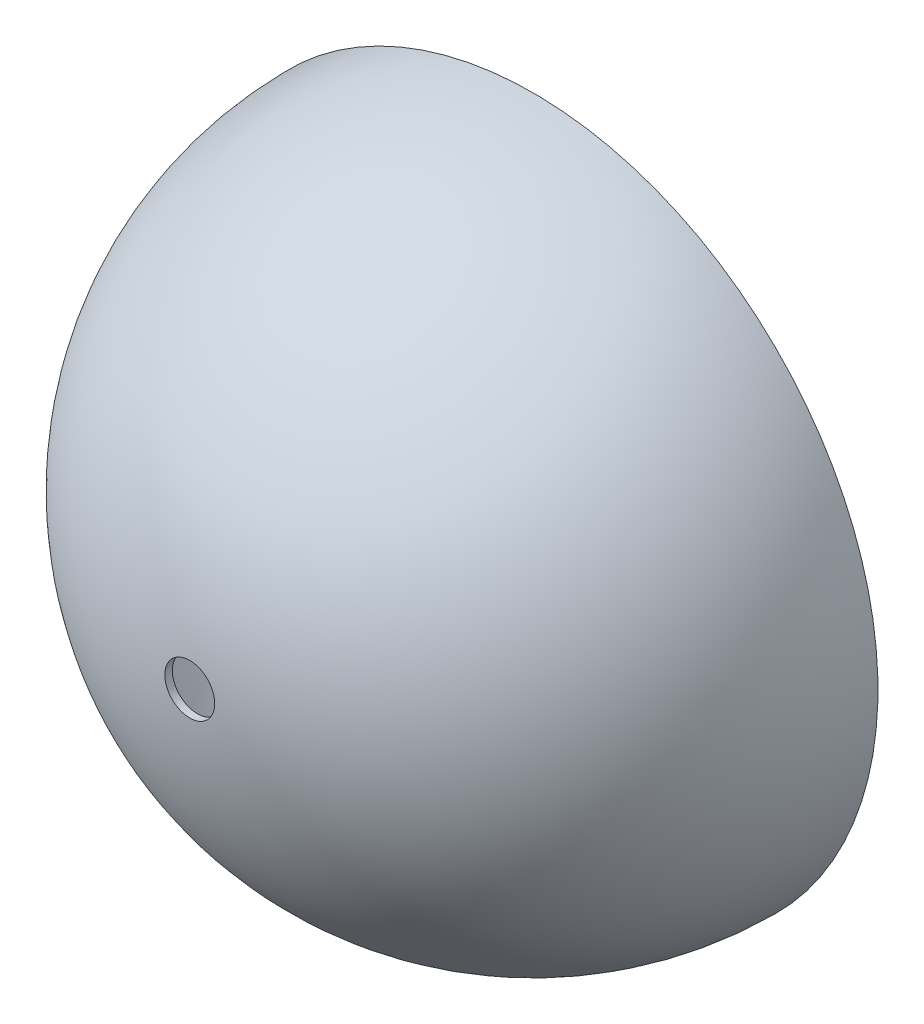
ISO-10303-21;
HEADER;
FILE_DESCRIPTION(('STEP AP214'),'2;1');
FILE_NAME('part.step','',(''),(''),'','','');
FILE_SCHEMA(('AUTOMOTIVE_DESIGN { 1 0 10303 214 1 1 1 1 }'));
ENDSEC;
DATA;
#1=APPLICATION_CONTEXT('core data for automotive mechanical design processes');
#2=APPLICATION_PROTOCOL_DEFINITION('international standard','automotive_design',2000,#1);
#3=PRODUCT_CONTEXT('',#1,'mechanical');
#4=PRODUCT('Part','Part','',(#3));
#5=PRODUCT_RELATED_PRODUCT_CATEGORY('part','',(#4));
#6=PRODUCT_DEFINITION_FORMATION('','',#4);
#7=PRODUCT_DEFINITION_CONTEXT('part definition',#1,'design');
#8=PRODUCT_DEFINITION('design','',#6,#7);
#9=PRODUCT_DEFINITION_SHAPE('','',#8);
#10=(LENGTH_UNIT() NAMED_UNIT(*) SI_UNIT(.MILLI.,.METRE.));
#11=(NAMED_UNIT(*) PLANE_ANGLE_UNIT() SI_UNIT($,.RADIAN.));
#12=(NAMED_UNIT(*) SI_UNIT($,.STERADIAN.) SOLID_ANGLE_UNIT());
#13=UNCERTAINTY_MEASURE_WITH_UNIT(LENGTH_MEASURE(1.E-05),#10,'distance_accuracy_value','');
#14=(GEOMETRIC_REPRESENTATION_CONTEXT(3) GLOBAL_UNCERTAINTY_ASSIGNED_CONTEXT((#13)) GLOBAL_UNIT_ASSIGNED_CONTEXT((#10,
#11,#12)) REPRESENTATION_CONTEXT('',''));
#15=CARTESIAN_POINT('',(0.,0.,0.));
#16=DIRECTION('',(0.,0.,1.));
#17=DIRECTION('',(1.,0.,0.));
#18=AXIS2_PLACEMENT_3D('',#15,#16,#17);
#19=CARTESIAN_POINT('',(-2.81668763803894E-13,0.,0.));
#20=DIRECTION('',(0.,1.,0.));
#21=DIRECTION('',(1.,0.,0.));
#22=AXIS2_PLACEMENT_3D('',#19,#20,#21);
#23=SPHERICAL_SURFACE('',#22,690.);
#24=CARTESIAN_POINT('',(-2.81668763803894E-13,0.,0.));
#25=DIRECTION('',(0.,0.,-1.));
#26=DIRECTION('',(-1.,0.,0.));
#27=AXIS2_PLACEMENT_3D('',#24,#25,#26);
#28=SPHERICAL_SURFACE('',#27,690.);
#29=CARTESIAN_POINT('',(0.,0.,688.18602136341));
#30=DIRECTION('',(0.,0.,-1.));
#31=DIRECTION('',(-1.,0.,0.));
#32=AXIS2_PLACEMENT_3D('',#29,#30,#31);
#33=CIRCLE('',#32,50.);
#34=CARTESIAN_POINT('',(50.,0.,688.18602136341));
#35=VERTEX_POINT('',#34);
#36=EDGE_CURVE('E47',#35,#35,#33,.T.);
#37=ORIENTED_EDGE('',*,*,#36,.T.);
#38=EDGE_LOOP('',(#37));
#39=FACE_BOUND('',#38,.T.);
#40=CARTESIAN_POINT('',(-2.81668763803894E-13,0.,0.));
#41=DIRECTION('',(0.,0.,-1.));
#42=DIRECTION('',(-1.,0.,0.));
#43=AXIS2_PLACEMENT_3D('',#40,#41,#42);
#44=CIRCLE('',#43,690.);
#45=CARTESIAN_POINT('',(-690.,-2.88607657707801E-13,-4.81824424760352E-12));
#46=VERTEX_POINT('',#45);
#47=EDGE_CURVE('E43',#46,#46,#44,.T.);
#48=ORIENTED_EDGE('',*,*,#47,.F.);
#49=EDGE_LOOP('',(#48));
#50=FACE_BOUND('',#49,.T.);
#51=ADVANCED_FACE('F35',(#39,#50),#28,.T.);
#52=CARTESIAN_POINT('',(-2.81668763803894E-13,0.,0.));
#53=DIRECTION('',(0.,1.,0.));
#54=DIRECTION('',(1.,0.,0.));
#55=AXIS2_PLACEMENT_3D('',#52,#53,#54);
#56=SPHERICAL_SURFACE('',#55,675.);
#57=CARTESIAN_POINT('',(-2.81668763803894E-13,0.,0.));
#58=DIRECTION('',(0.,0.,-1.));
#59=DIRECTION('',(-1.,0.,0.));
#60=AXIS2_PLACEMENT_3D('',#57,#58,#59);
#61=SPHERICAL_SURFACE('',#60,675.);
#62=CARTESIAN_POINT('',(0.,0.,673.145600891813));
#63=DIRECTION('',(0.,0.,-1.));
#64=DIRECTION('',(-1.,0.,0.));
#65=AXIS2_PLACEMENT_3D('',#62,#63,#64);
#66=CIRCLE('',#65,50.);
#67=CARTESIAN_POINT('',(50.,0.,673.145600891813));
#68=VERTEX_POINT('',#67);
#69=EDGE_CURVE('E39',#68,#68,#66,.F.);
#70=ORIENTED_EDGE('',*,*,#69,.T.);
#71=EDGE_LOOP('',(#70));
#72=FACE_BOUND('',#71,.T.);
#73=CARTESIAN_POINT('',(-2.81668763803894E-13,0.,0.));
#74=DIRECTION('',(0.,0.,1.));
#75=DIRECTION('',(-1.,0.,0.));
#76=AXIS2_PLACEMENT_3D('',#73,#74,#75);
#77=CIRCLE('',#76,675.);
#78=CARTESIAN_POINT('',(-675.,-2.82484423712064E-13,-4.71349980743823E-12));
#79=VERTEX_POINT('',#78);
#80=EDGE_CURVE('E10',#79,#79,#77,.T.);
#81=ORIENTED_EDGE('',*,*,#80,.F.);
#82=EDGE_LOOP('',(#81));
#83=FACE_BOUND('',#82,.T.);
#84=ADVANCED_FACE('F37',(#72,#83),#61,.F.);
#85=CARTESIAN_POINT('',(-2.81668763803894E-13,0.,0.));
#86=DIRECTION('',(0.,0.,-1.));
#87=DIRECTION('',(-1.,0.,0.));
#88=AXIS2_PLACEMENT_3D('',#85,#86,#87);
#89=PLANE('',#88);
#90=ORIENTED_EDGE('',*,*,#80,.T.);
#91=EDGE_LOOP('',(#90));
#92=FACE_BOUND('',#91,.T.);
#93=ORIENTED_EDGE('',*,*,#47,.T.);
#94=EDGE_LOOP('',(#93));
#95=FACE_BOUND('',#94,.T.);
#96=ADVANCED_FACE('F61',(#92,#95),#89,.T.);
#97=CARTESIAN_POINT('',(0.,0.,-1.2E-05));
#98=DIRECTION('',(0.,0.,1.));
#99=DIRECTION('',(1.,0.,0.));
#100=AXIS2_PLACEMENT_3D('',#97,#98,#99);
#101=CYLINDRICAL_SURFACE('',#100,50.);
#102=CARTESIAN_POINT('',(50.,0.,673.145600891813));
#103=CARTESIAN_POINT('',(50.,0.,673.302271938392));
#104=CARTESIAN_POINT('',(50.,0.,673.458942984971));
#105=CARTESIAN_POINT('',(50.,0.,673.77228507813));
#106=CARTESIAN_POINT('',(50.,0.,673.928956124709));
#107=CARTESIAN_POINT('',(50.,0.,674.242298217867));
#108=CARTESIAN_POINT('',(50.,0.,674.398969264446));
#109=CARTESIAN_POINT('',(50.,0.,674.712311357604));
#110=CARTESIAN_POINT('',(50.,0.,674.868982404184));
#111=CARTESIAN_POINT('',(50.,0.,675.182324497342));
#112=CARTESIAN_POINT('',(50.,0.,675.338995543921));
#113=CARTESIAN_POINT('',(50.,0.,675.652337637079));
#114=CARTESIAN_POINT('',(50.,0.,675.809008683658));
#115=CARTESIAN_POINT('',(50.,0.,676.122350776817));
#116=CARTESIAN_POINT('',(50.,0.,676.279021823396));
#117=CARTESIAN_POINT('',(50.,0.,676.592363916554));
#118=CARTESIAN_POINT('',(50.,0.,676.749034963133));
#119=CARTESIAN_POINT('',(50.,0.,677.062377056291));
#120=CARTESIAN_POINT('',(50.,0.,677.219048102871));
#121=CARTESIAN_POINT('',(50.,0.,677.532390196029));
#122=CARTESIAN_POINT('',(50.,0.,677.689061242608));
#123=CARTESIAN_POINT('',(50.,0.,678.002403335766));
#124=CARTESIAN_POINT('',(50.,0.,678.159074382345));
#125=CARTESIAN_POINT('',(50.,0.,678.472416475504));
#126=CARTESIAN_POINT('',(50.,0.,678.629087522083));
#127=CARTESIAN_POINT('',(50.,0.,678.942429615241));
#128=CARTESIAN_POINT('',(50.,0.,679.09910066182));
#129=CARTESIAN_POINT('',(50.,0.,679.412442754978));
#130=CARTESIAN_POINT('',(50.,0.,679.569113801558));
#131=CARTESIAN_POINT('',(50.,0.,679.882455894716));
#132=CARTESIAN_POINT('',(50.,0.,680.039126941295));
#133=CARTESIAN_POINT('',(50.,0.,680.352469034453));
#134=CARTESIAN_POINT('',(50.,0.,680.509140081032));
#135=CARTESIAN_POINT('',(50.,0.,680.822482174191));
#136=CARTESIAN_POINT('',(50.,0.,680.97915322077));
#137=CARTESIAN_POINT('',(50.,0.,681.292495313928));
#138=CARTESIAN_POINT('',(50.,0.,681.449166360507));
#139=CARTESIAN_POINT('',(50.,0.,681.762508453666));
#140=CARTESIAN_POINT('',(50.,0.,681.919179500245));
#141=CARTESIAN_POINT('',(50.,0.,682.232521593403));
#142=CARTESIAN_POINT('',(50.,0.,682.389192639982));
#143=CARTESIAN_POINT('',(50.,0.,682.70253473314));
#144=CARTESIAN_POINT('',(50.,0.,682.859205779719));
#145=CARTESIAN_POINT('',(50.,0.,683.172547872878));
#146=CARTESIAN_POINT('',(50.,0.,683.329218919457));
#147=CARTESIAN_POINT('',(50.,0.,683.642561012615));
#148=CARTESIAN_POINT('',(50.,0.,683.799232059194));
#149=CARTESIAN_POINT('',(50.,0.,684.112574152353));
#150=CARTESIAN_POINT('',(50.,0.,684.269245198932));
#151=CARTESIAN_POINT('',(50.,0.,684.58258729209));
#152=CARTESIAN_POINT('',(50.,0.,684.739258338669));
#153=CARTESIAN_POINT('',(50.,0.,685.052600431827));
#154=CARTESIAN_POINT('',(50.,0.,685.209271478406));
#155=CARTESIAN_POINT('',(50.,0.,685.522613571565));
#156=CARTESIAN_POINT('',(50.,0.,685.679284618144));
#157=CARTESIAN_POINT('',(50.,0.,685.992626711302));
#158=CARTESIAN_POINT('',(50.,0.,686.149297757881));
#159=CARTESIAN_POINT('',(50.,0.,686.46263985104));
#160=CARTESIAN_POINT('',(50.,0.,686.619310897619));
#161=CARTESIAN_POINT('',(50.,0.,686.932652990777));
#162=CARTESIAN_POINT('',(50.,0.,687.089324037356));
#163=CARTESIAN_POINT('',(50.,0.,687.402666130514));
#164=CARTESIAN_POINT('',(50.,0.,687.559337177094));
#165=CARTESIAN_POINT('',(50.,0.,687.872679270252));
#166=CARTESIAN_POINT('',(50.,0.,688.029350316831));
#167=CARTESIAN_POINT('',(50.,0.,688.18602136341));
#168=B_SPLINE_CURVE_WITH_KNOTS('',3,(#102,#103,#104,#105,#106,#107,#108,#109,#110,#111,#112,
#113,#114,#115,#116,#117,#118,#119,#120,#121,#122,#123,#124,#125,#126,#127,#128,#129,#130,#131,
#132,#133,#134,#135,#136,#137,#138,#139,#140,#141,#142,#143,#144,#145,#146,#147,#148,#149,#150,
#151,#152,#153,#154,#155,#156,#157,#158,#159,#160,#161,#162,#163,#164,#165,#166,#167),
.UNSPECIFIED.,.F.,.F.,(4,2,2,2,2,2,2,2,2,2,2,2,2,2,2,2,2,2,2,2,2,2,2,2,2,2,2,2,2,2,2,2,4),(0.,
0.47001313973738,0.940026279474759,1.41003941921225,1.88005255894963,2.35006569868701,
2.8200788384245,3.29009197816188,3.76010511789926,4.23011825763664,4.70013139737402,
5.17014453711151,5.64015767684889,6.11017081658627,6.58018395632376,7.05019709606114,
7.52021023579852,7.9902233755359,8.46023651527328,8.93024965501077,9.40026279474815,
9.87027593448553,10.340289074223,10.8103022139604,11.2803153536978,11.7503284934352,
12.2203416331725,12.69035477291,13.1603679126474,13.6303810523848,14.1003941921223,
14.5704073318597,15.040420471597),.UNSPECIFIED.);
#169=EDGE_CURVE('BSEAM58',#68,#35,#168,.T.);
#170=ORIENTED_EDGE('',*,*,#69,.F.);
#171=ORIENTED_EDGE('',*,*,#36,.F.);
#172=ORIENTED_EDGE('',*,*,#169,.T.);
#173=ORIENTED_EDGE('',*,*,#169,.F.);
#174=EDGE_LOOP('',(#170,#172,#171,#173));
#175=FACE_BOUND('',#174,.T.);
#176=ADVANCED_FACE('F58',(#175),#101,.F.);
#177=CLOSED_SHELL('',(#51,#84,#96,#176));
#178=MANIFOLD_SOLID_BREP('B2',#177);
#179=ADVANCED_BREP_SHAPE_REPRESENTATION('',(#18,#178),#14);
#180=SHAPE_DEFINITION_REPRESENTATION(#9,#179);
ENDSEC;
END-ISO-10303-21;
